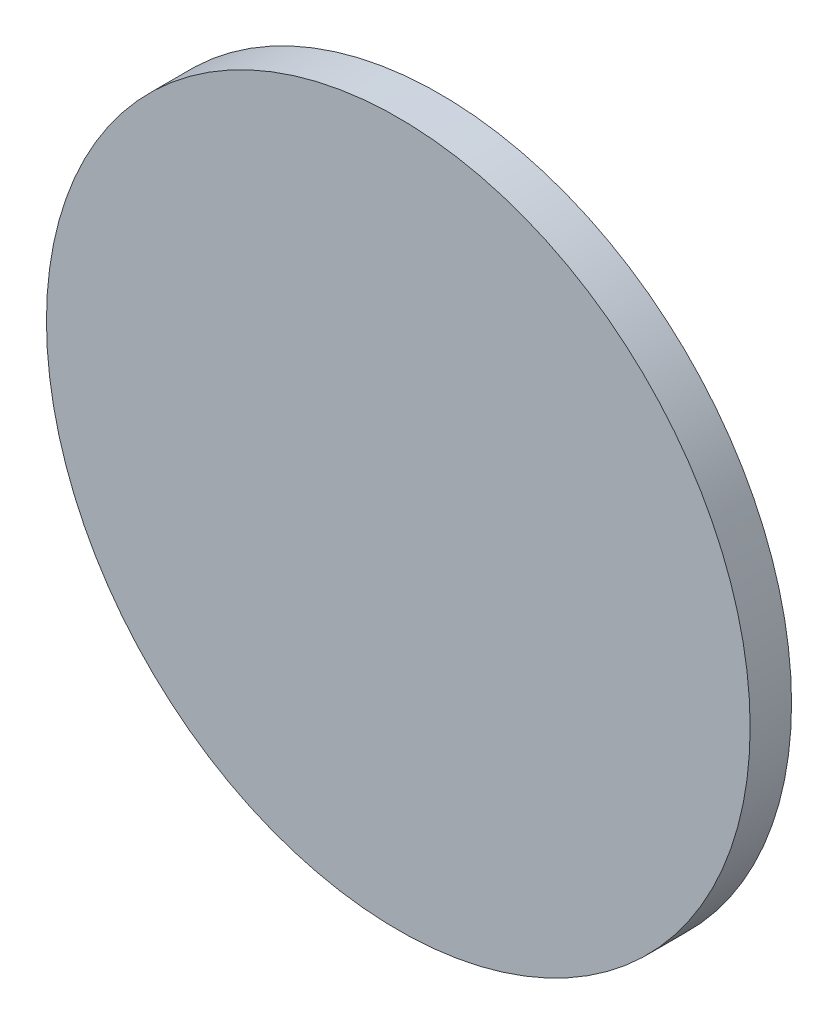
ISO-10303-21;
HEADER;
FILE_DESCRIPTION(('STEP AP214'),'2;1');
FILE_NAME('part.step','',(''),(''),'','','');
FILE_SCHEMA(('AUTOMOTIVE_DESIGN { 1 0 10303 214 1 1 1 1 }'));
ENDSEC;
DATA;
#1=APPLICATION_CONTEXT('core data for automotive mechanical design processes');
#2=APPLICATION_PROTOCOL_DEFINITION('international standard','automotive_design',2000,#1);
#3=PRODUCT_CONTEXT('',#1,'mechanical');
#4=PRODUCT('Part','Part','',(#3));
#5=PRODUCT_RELATED_PRODUCT_CATEGORY('part','',(#4));
#6=PRODUCT_DEFINITION_FORMATION('','',#4);
#7=PRODUCT_DEFINITION_CONTEXT('part definition',#1,'design');
#8=PRODUCT_DEFINITION('design','',#6,#7);
#9=PRODUCT_DEFINITION_SHAPE('','',#8);
#10=(LENGTH_UNIT() NAMED_UNIT(*) SI_UNIT(.MILLI.,.METRE.));
#11=(NAMED_UNIT(*) PLANE_ANGLE_UNIT() SI_UNIT($,.RADIAN.));
#12=(NAMED_UNIT(*) SI_UNIT($,.STERADIAN.) SOLID_ANGLE_UNIT());
#13=UNCERTAINTY_MEASURE_WITH_UNIT(LENGTH_MEASURE(1.E-05),#10,'distance_accuracy_value','');
#14=(GEOMETRIC_REPRESENTATION_CONTEXT(3) GLOBAL_UNCERTAINTY_ASSIGNED_CONTEXT((#13)) GLOBAL_UNIT_ASSIGNED_CONTEXT((#10,
#11,#12)) REPRESENTATION_CONTEXT('',''));
#15=CARTESIAN_POINT('',(0.,0.,0.));
#16=DIRECTION('',(0.,0.,1.));
#17=DIRECTION('',(1.,0.,0.));
#18=AXIS2_PLACEMENT_3D('',#15,#16,#17);
#19=CARTESIAN_POINT('',(0.,0.,3.));
#20=DIRECTION('',(0.,0.,-1.));
#21=DIRECTION('',(-1.,0.,0.));
#22=AXIS2_PLACEMENT_3D('',#19,#20,#21);
#23=CYLINDRICAL_SURFACE('',#22,25.5);
#24=CARTESIAN_POINT('',(0.,0.,3.));
#25=DIRECTION('',(0.,0.,1.));
#26=DIRECTION('',(1.,0.,0.));
#27=AXIS2_PLACEMENT_3D('',#24,#25,#26);
#28=CIRCLE('',#27,25.5);
#29=CARTESIAN_POINT('',(25.5,0.,3.));
#30=VERTEX_POINT('',#29);
#31=EDGE_CURVE('E10',#30,#30,#28,.T.);
#32=ORIENTED_EDGE('',*,*,#31,.F.);
#33=EDGE_LOOP('',(#32));
#34=FACE_BOUND('',#33,.T.);
#35=CARTESIAN_POINT('',(0.,0.,0.));
#36=DIRECTION('',(0.,0.,1.));
#37=DIRECTION('',(1.,0.,0.));
#38=AXIS2_PLACEMENT_3D('',#35,#36,#37);
#39=CIRCLE('',#38,25.5);
#40=CARTESIAN_POINT('',(25.5,0.,0.));
#41=VERTEX_POINT('',#40);
#42=EDGE_CURVE('E34',#41,#41,#39,.T.);
#43=ORIENTED_EDGE('',*,*,#42,.T.);
#44=EDGE_LOOP('',(#43));
#45=FACE_BOUND('',#44,.T.);
#46=ADVANCED_FACE('F31',(#34,#45),#23,.T.);
#47=CARTESIAN_POINT('',(0.,0.,3.));
#48=DIRECTION('',(0.,0.,1.));
#49=DIRECTION('',(1.,0.,0.));
#50=AXIS2_PLACEMENT_3D('',#47,#48,#49);
#51=PLANE('',#50);
#52=ORIENTED_EDGE('',*,*,#31,.T.);
#53=EDGE_LOOP('',(#52));
#54=FACE_BOUND('',#53,.T.);
#55=ADVANCED_FACE('F46',(#54),#51,.T.);
#56=CARTESIAN_POINT('',(0.,0.,0.));
#57=DIRECTION('',(0.,0.,1.));
#58=DIRECTION('',(1.,0.,0.));
#59=AXIS2_PLACEMENT_3D('',#56,#57,#58);
#60=PLANE('',#59);
#61=ORIENTED_EDGE('',*,*,#42,.F.);
#62=EDGE_LOOP('',(#61));
#63=FACE_BOUND('',#62,.T.);
#64=ADVANCED_FACE('F44',(#63),#60,.F.);
#65=CLOSED_SHELL('',(#46,#55,#64));
#66=MANIFOLD_SOLID_BREP('B2',#65);
#67=ADVANCED_BREP_SHAPE_REPRESENTATION('',(#18,#66),#14);
#68=SHAPE_DEFINITION_REPRESENTATION(#9,#67);
ENDSEC;
END-ISO-10303-21;
